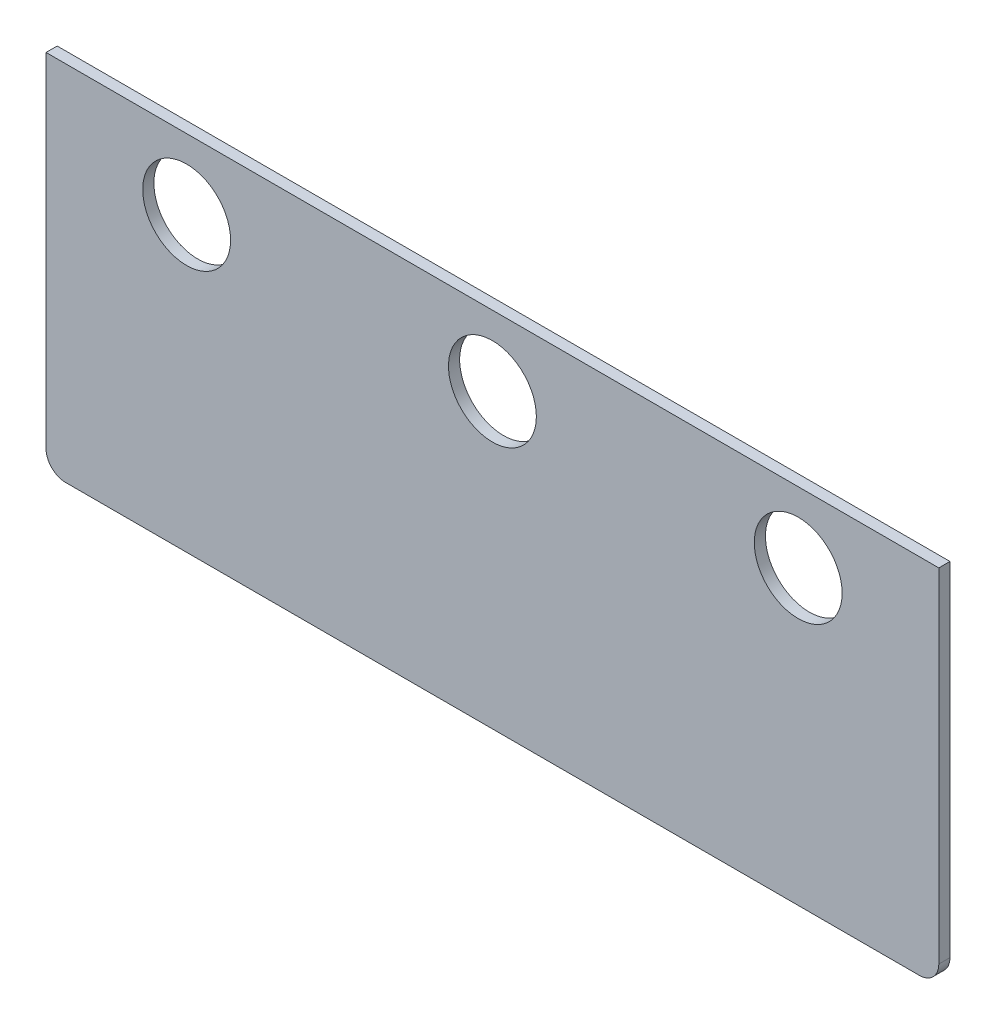
ISO-10303-21;
HEADER;
FILE_DESCRIPTION(('STEP AP214'),'2;1');
FILE_NAME('part.step','',(''),(''),'','','');
FILE_SCHEMA(('AUTOMOTIVE_DESIGN { 1 0 10303 214 1 1 1 1 }'));
ENDSEC;
DATA;
#1=APPLICATION_CONTEXT('core data for automotive mechanical design processes');
#2=APPLICATION_PROTOCOL_DEFINITION('international standard','automotive_design',2000,#1);
#3=PRODUCT_CONTEXT('',#1,'mechanical');
#4=PRODUCT('Part','Part','',(#3));
#5=PRODUCT_RELATED_PRODUCT_CATEGORY('part','',(#4));
#6=PRODUCT_DEFINITION_FORMATION('','',#4);
#7=PRODUCT_DEFINITION_CONTEXT('part definition',#1,'design');
#8=PRODUCT_DEFINITION('design','',#6,#7);
#9=PRODUCT_DEFINITION_SHAPE('','',#8);
#10=(LENGTH_UNIT() NAMED_UNIT(*) SI_UNIT(.MILLI.,.METRE.));
#11=(NAMED_UNIT(*) PLANE_ANGLE_UNIT() SI_UNIT($,.RADIAN.));
#12=(NAMED_UNIT(*) SI_UNIT($,.STERADIAN.) SOLID_ANGLE_UNIT());
#13=UNCERTAINTY_MEASURE_WITH_UNIT(LENGTH_MEASURE(1.E-05),#10,'distance_accuracy_value','');
#14=(GEOMETRIC_REPRESENTATION_CONTEXT(3) GLOBAL_UNCERTAINTY_ASSIGNED_CONTEXT((#13)) GLOBAL_UNIT_ASSIGNED_CONTEXT((#10,
#11,#12)) REPRESENTATION_CONTEXT('',''));
#15=CARTESIAN_POINT('',(0.,0.,0.));
#16=DIRECTION('',(0.,0.,1.));
#17=DIRECTION('',(1.,0.,0.));
#18=AXIS2_PLACEMENT_3D('',#15,#16,#17);
#19=CARTESIAN_POINT('',(0.,0.,3.17499999999998));
#20=DIRECTION('',(0.,0.,1.));
#21=DIRECTION('',(1.,0.,0.));
#22=AXIS2_PLACEMENT_3D('',#19,#20,#21);
#23=PLANE('',#22);
#24=CARTESIAN_POINT('',(-87.,83.1750000000001,3.17499999999998));
#25=DIRECTION('',(0.,0.,1.));
#26=DIRECTION('',(1.,0.,0.));
#27=AXIS2_PLACEMENT_3D('',#24,#25,#26);
#28=CIRCLE('',#27,12.5);
#29=CARTESIAN_POINT('',(-74.5,83.1750000000001,3.17499999999998));
#30=VERTEX_POINT('',#29);
#31=EDGE_CURVE('E151',#30,#30,#28,.T.);
#32=ORIENTED_EDGE('',*,*,#31,.F.);
#33=EDGE_LOOP('',(#32));
#34=FACE_BOUND('',#33,.T.);
#35=DIRECTION('',(1.,0.,0.));
#36=VECTOR('',#35,1.);
#37=CARTESIAN_POINT('',(-127.,0.,3.17499999999998));
#38=LINE('',#37,#36);
#39=CARTESIAN_POINT('',(-121.44375,0.,3.17499999999998));
#40=VERTEX_POINT('',#39);
#41=CARTESIAN_POINT('',(121.44375,0.,3.17499999999998));
#42=VERTEX_POINT('',#41);
#43=EDGE_CURVE('E94',#40,#42,#38,.T.);
#44=ORIENTED_EDGE('',*,*,#43,.T.);
#45=CARTESIAN_POINT('',(121.44375,5.55625000000004,3.17499999999998));
#46=DIRECTION('',(0.,0.,1.));
#47=DIRECTION('',(1.,0.,0.));
#48=AXIS2_PLACEMENT_3D('',#45,#46,#47);
#49=CIRCLE('',#48,5.55625);
#50=CARTESIAN_POINT('',(127.,5.55625000000004,3.17499999999998));
#51=VERTEX_POINT('',#50);
#52=EDGE_CURVE('E42',#42,#51,#49,.T.);
#53=ORIENTED_EDGE('',*,*,#52,.T.);
#54=DIRECTION('',(0.,1.,0.));
#55=VECTOR('',#54,1.);
#56=CARTESIAN_POINT('',(127.,0.,3.17499999999998));
#57=LINE('',#56,#55);
#58=CARTESIAN_POINT('',(127.,103.175,3.17499999999998));
#59=VERTEX_POINT('',#58);
#60=EDGE_CURVE('E100',#51,#59,#57,.T.);
#61=ORIENTED_EDGE('',*,*,#60,.T.);
#62=DIRECTION('',(-1.,0.,0.));
#63=VECTOR('',#62,1.);
#64=CARTESIAN_POINT('',(127.,103.175,3.17499999999998));
#65=LINE('',#64,#63);
#66=CARTESIAN_POINT('',(-127.,103.175,3.17499999999998));
#67=VERTEX_POINT('',#66);
#68=EDGE_CURVE('E95',#59,#67,#65,.T.);
#69=ORIENTED_EDGE('',*,*,#68,.T.);
#70=DIRECTION('',(0.,-1.,0.));
#71=VECTOR('',#70,1.);
#72=CARTESIAN_POINT('',(-127.,103.175,3.17499999999998));
#73=LINE('',#72,#71);
#74=CARTESIAN_POINT('',(-127.,5.55625000000004,3.17499999999998));
#75=VERTEX_POINT('',#74);
#76=EDGE_CURVE('E86',#67,#75,#73,.T.);
#77=ORIENTED_EDGE('',*,*,#76,.T.);
#78=CARTESIAN_POINT('',(-121.44375,5.55625000000004,3.17499999999998));
#79=DIRECTION('',(0.,0.,1.));
#80=DIRECTION('',(1.,0.,0.));
#81=AXIS2_PLACEMENT_3D('',#78,#79,#80);
#82=CIRCLE('',#81,5.55625);
#83=EDGE_CURVE('E125',#75,#40,#82,.T.);
#84=ORIENTED_EDGE('',*,*,#83,.T.);
#85=EDGE_LOOP('',(#44,#53,#61,#69,#77,#84));
#86=FACE_BOUND('',#85,.T.);
#87=CARTESIAN_POINT('',(87.,83.1750000000001,3.17499999999998));
#88=DIRECTION('',(0.,0.,1.));
#89=DIRECTION('',(1.,0.,0.));
#90=AXIS2_PLACEMENT_3D('',#87,#88,#89);
#91=CIRCLE('',#90,12.5);
#92=CARTESIAN_POINT('',(99.5,83.1750000000001,3.17499999999998));
#93=VERTEX_POINT('',#92);
#94=EDGE_CURVE('E145',#93,#93,#91,.T.);
#95=ORIENTED_EDGE('',*,*,#94,.F.);
#96=EDGE_LOOP('',(#95));
#97=FACE_BOUND('',#96,.T.);
#98=CARTESIAN_POINT('',(0.,83.1750000000001,3.17499999999998));
#99=DIRECTION('',(0.,0.,1.));
#100=DIRECTION('',(1.,0.,0.));
#101=AXIS2_PLACEMENT_3D('',#98,#99,#100);
#102=CIRCLE('',#101,12.5);
#103=CARTESIAN_POINT('',(12.5,83.1750000000001,3.17499999999998));
#104=VERTEX_POINT('',#103);
#105=EDGE_CURVE('E157',#104,#104,#102,.T.);
#106=ORIENTED_EDGE('',*,*,#105,.F.);
#107=EDGE_LOOP('',(#106));
#108=FACE_BOUND('',#107,.T.);
#109=ADVANCED_FACE('F34',(#34,#86,#97,#108),#23,.T.);
#110=CARTESIAN_POINT('',(0.,0.,0.));
#111=DIRECTION('',(0.,0.,1.));
#112=DIRECTION('',(1.,0.,0.));
#113=AXIS2_PLACEMENT_3D('',#110,#111,#112);
#114=PLANE('',#113);
#115=DIRECTION('',(0.,1.,0.));
#116=VECTOR('',#115,1.);
#117=CARTESIAN_POINT('',(127.,0.,0.));
#118=LINE('',#117,#116);
#119=CARTESIAN_POINT('',(127.,5.55625000000004,0.));
#120=VERTEX_POINT('',#119);
#121=CARTESIAN_POINT('',(127.,103.175,0.));
#122=VERTEX_POINT('',#121);
#123=EDGE_CURVE('E104',#120,#122,#118,.T.);
#124=ORIENTED_EDGE('',*,*,#123,.F.);
#125=CARTESIAN_POINT('',(121.44375,5.55625000000004,0.));
#126=DIRECTION('',(0.,0.,1.));
#127=DIRECTION('',(1.,0.,0.));
#128=AXIS2_PLACEMENT_3D('',#125,#126,#127);
#129=CIRCLE('',#128,5.55625);
#130=CARTESIAN_POINT('',(121.44375,0.,0.));
#131=VERTEX_POINT('',#130);
#132=EDGE_CURVE('E119',#120,#131,#129,.F.);
#133=ORIENTED_EDGE('',*,*,#132,.T.);
#134=DIRECTION('',(1.,0.,0.));
#135=VECTOR('',#134,1.);
#136=CARTESIAN_POINT('',(-127.,0.,0.));
#137=LINE('',#136,#135);
#138=CARTESIAN_POINT('',(-121.44375,0.,0.));
#139=VERTEX_POINT('',#138);
#140=EDGE_CURVE('E138',#139,#131,#137,.T.);
#141=ORIENTED_EDGE('',*,*,#140,.F.);
#142=CARTESIAN_POINT('',(-121.44375,5.55625000000004,0.));
#143=DIRECTION('',(0.,0.,1.));
#144=DIRECTION('',(1.,0.,0.));
#145=AXIS2_PLACEMENT_3D('',#142,#143,#144);
#146=CIRCLE('',#145,5.55625);
#147=CARTESIAN_POINT('',(-127.,5.55625000000004,0.));
#148=VERTEX_POINT('',#147);
#149=EDGE_CURVE('E113',#139,#148,#146,.F.);
#150=ORIENTED_EDGE('',*,*,#149,.T.);
#151=DIRECTION('',(0.,-1.,0.));
#152=VECTOR('',#151,1.);
#153=CARTESIAN_POINT('',(-127.,103.175,0.));
#154=LINE('',#153,#152);
#155=CARTESIAN_POINT('',(-127.,103.175,0.));
#156=VERTEX_POINT('',#155);
#157=EDGE_CURVE('E141',#156,#148,#154,.T.);
#158=ORIENTED_EDGE('',*,*,#157,.F.);
#159=DIRECTION('',(-1.,0.,0.));
#160=VECTOR('',#159,1.);
#161=CARTESIAN_POINT('',(127.,103.175,0.));
#162=LINE('',#161,#160);
#163=EDGE_CURVE('E108',#122,#156,#162,.T.);
#164=ORIENTED_EDGE('',*,*,#163,.F.);
#165=EDGE_LOOP('',(#124,#133,#141,#150,#158,#164));
#166=FACE_BOUND('',#165,.T.);
#167=CARTESIAN_POINT('',(87.,83.1750000000001,0.));
#168=DIRECTION('',(0.,0.,1.));
#169=DIRECTION('',(1.,0.,0.));
#170=AXIS2_PLACEMENT_3D('',#167,#168,#169);
#171=CIRCLE('',#170,12.5);
#172=CARTESIAN_POINT('',(99.5,83.1750000000001,0.));
#173=VERTEX_POINT('',#172);
#174=EDGE_CURVE('E148',#173,#173,#171,.T.);
#175=ORIENTED_EDGE('',*,*,#174,.T.);
#176=EDGE_LOOP('',(#175));
#177=FACE_BOUND('',#176,.T.);
#178=CARTESIAN_POINT('',(-87.,83.1750000000001,0.));
#179=DIRECTION('',(0.,0.,1.));
#180=DIRECTION('',(1.,0.,0.));
#181=AXIS2_PLACEMENT_3D('',#178,#179,#180);
#182=CIRCLE('',#181,12.5);
#183=CARTESIAN_POINT('',(-74.5,83.1750000000001,0.));
#184=VERTEX_POINT('',#183);
#185=EDGE_CURVE('E154',#184,#184,#182,.T.);
#186=ORIENTED_EDGE('',*,*,#185,.T.);
#187=EDGE_LOOP('',(#186));
#188=FACE_BOUND('',#187,.T.);
#189=CARTESIAN_POINT('',(0.,83.1750000000001,0.));
#190=DIRECTION('',(0.,0.,1.));
#191=DIRECTION('',(1.,0.,0.));
#192=AXIS2_PLACEMENT_3D('',#189,#190,#191);
#193=CIRCLE('',#192,12.5);
#194=CARTESIAN_POINT('',(12.5,83.1750000000001,0.));
#195=VERTEX_POINT('',#194);
#196=EDGE_CURVE('E160',#195,#195,#193,.T.);
#197=ORIENTED_EDGE('',*,*,#196,.T.);
#198=EDGE_LOOP('',(#197));
#199=FACE_BOUND('',#198,.T.);
#200=ADVANCED_FACE('F136',(#166,#177,#188,#199),#114,.F.);
#201=CARTESIAN_POINT('',(127.,103.175,3.17499999999998));
#202=DIRECTION('',(0.,-1.,0.));
#203=DIRECTION('',(0.,0.,-1.));
#204=AXIS2_PLACEMENT_3D('',#201,#202,#203);
#205=PLANE('',#204);
#206=ORIENTED_EDGE('',*,*,#163,.T.);
#207=DIRECTION('',(0.,0.,-1.));
#208=VECTOR('',#207,1.);
#209=CARTESIAN_POINT('',(-127.,103.175,3.17499999999998));
#210=LINE('',#209,#208);
#211=EDGE_CURVE('E90',#67,#156,#210,.T.);
#212=ORIENTED_EDGE('',*,*,#211,.F.);
#213=ORIENTED_EDGE('',*,*,#68,.F.);
#214=DIRECTION('',(0.,0.,-1.));
#215=VECTOR('',#214,1.);
#216=CARTESIAN_POINT('',(127.,103.175,3.17499999999998));
#217=LINE('',#216,#215);
#218=EDGE_CURVE('E110',#59,#122,#217,.T.);
#219=ORIENTED_EDGE('',*,*,#218,.T.);
#220=EDGE_LOOP('',(#206,#212,#213,#219));
#221=FACE_BOUND('',#220,.T.);
#222=ADVANCED_FACE('F106',(#221),#205,.F.);
#223=CARTESIAN_POINT('',(-127.,103.175,3.17499999999998));
#224=DIRECTION('',(1.,0.,0.));
#225=DIRECTION('',(0.,0.,-1.));
#226=AXIS2_PLACEMENT_3D('',#223,#224,#225);
#227=PLANE('',#226);
#228=ORIENTED_EDGE('',*,*,#157,.T.);
#229=DIRECTION('',(0.,0.,-1.));
#230=VECTOR('',#229,1.);
#231=CARTESIAN_POINT('',(-127.,5.55625000000004,3.17499999999998));
#232=LINE('',#231,#230);
#233=EDGE_CURVE('E11',#148,#75,#232,.F.);
#234=ORIENTED_EDGE('',*,*,#233,.T.);
#235=ORIENTED_EDGE('',*,*,#76,.F.);
#236=ORIENTED_EDGE('',*,*,#211,.T.);
#237=EDGE_LOOP('',(#228,#234,#235,#236));
#238=FACE_BOUND('',#237,.T.);
#239=ADVANCED_FACE('F88',(#238),#227,.F.);
#240=CARTESIAN_POINT('',(-127.,0.,3.17499999999998));
#241=DIRECTION('',(0.,1.,0.));
#242=DIRECTION('',(-1.,0.,0.));
#243=AXIS2_PLACEMENT_3D('',#240,#241,#242);
#244=PLANE('',#243);
#245=ORIENTED_EDGE('',*,*,#140,.T.);
#246=DIRECTION('',(0.,0.,-1.));
#247=VECTOR('',#246,1.);
#248=CARTESIAN_POINT('',(121.44375,0.,3.17499999999998));
#249=LINE('',#248,#247);
#250=EDGE_CURVE('E55',#131,#42,#249,.F.);
#251=ORIENTED_EDGE('',*,*,#250,.T.);
#252=ORIENTED_EDGE('',*,*,#43,.F.);
#253=DIRECTION('',(0.,0.,-1.));
#254=VECTOR('',#253,1.);
#255=CARTESIAN_POINT('',(-121.44375,0.,3.17499999999998));
#256=LINE('',#255,#254);
#257=EDGE_CURVE('E121',#40,#139,#256,.T.);
#258=ORIENTED_EDGE('',*,*,#257,.T.);
#259=EDGE_LOOP('',(#245,#251,#252,#258));
#260=FACE_BOUND('',#259,.T.);
#261=ADVANCED_FACE('F139',(#260),#244,.F.);
#262=CARTESIAN_POINT('',(127.,0.,3.17499999999998));
#263=DIRECTION('',(-1.,0.,0.));
#264=DIRECTION('',(0.,-1.,0.));
#265=AXIS2_PLACEMENT_3D('',#262,#263,#264);
#266=PLANE('',#265);
#267=ORIENTED_EDGE('',*,*,#60,.F.);
#268=DIRECTION('',(0.,0.,-1.));
#269=VECTOR('',#268,1.);
#270=CARTESIAN_POINT('',(127.,5.55625000000004,3.17499999999998));
#271=LINE('',#270,#269);
#272=EDGE_CURVE('E109',#51,#120,#271,.T.);
#273=ORIENTED_EDGE('',*,*,#272,.T.);
#274=ORIENTED_EDGE('',*,*,#123,.T.);
#275=ORIENTED_EDGE('',*,*,#218,.F.);
#276=EDGE_LOOP('',(#267,#273,#274,#275));
#277=FACE_BOUND('',#276,.T.);
#278=ADVANCED_FACE('F130',(#277),#266,.F.);
#279=CARTESIAN_POINT('',(87.,83.1750000000001,3.17499999999998));
#280=DIRECTION('',(0.,0.,-1.));
#281=DIRECTION('',(-1.,0.,0.));
#282=AXIS2_PLACEMENT_3D('',#279,#280,#281);
#283=CYLINDRICAL_SURFACE('',#282,12.5);
#284=ORIENTED_EDGE('',*,*,#94,.T.);
#285=EDGE_LOOP('',(#284));
#286=FACE_BOUND('',#285,.T.);
#287=ORIENTED_EDGE('',*,*,#174,.F.);
#288=EDGE_LOOP('',(#287));
#289=FACE_BOUND('',#288,.T.);
#290=ADVANCED_FACE('F178',(#286,#289),#283,.F.);
#291=CARTESIAN_POINT('',(-87.,83.1750000000001,3.17499999999998));
#292=DIRECTION('',(0.,0.,-1.));
#293=DIRECTION('',(-1.,0.,0.));
#294=AXIS2_PLACEMENT_3D('',#291,#292,#293);
#295=CYLINDRICAL_SURFACE('',#294,12.5);
#296=ORIENTED_EDGE('',*,*,#31,.T.);
#297=EDGE_LOOP('',(#296));
#298=FACE_BOUND('',#297,.T.);
#299=ORIENTED_EDGE('',*,*,#185,.F.);
#300=EDGE_LOOP('',(#299));
#301=FACE_BOUND('',#300,.T.);
#302=ADVANCED_FACE('F194',(#298,#301),#295,.F.);
#303=CARTESIAN_POINT('',(0.,83.1750000000001,3.17499999999998));
#304=DIRECTION('',(0.,0.,-1.));
#305=DIRECTION('',(-1.,0.,0.));
#306=AXIS2_PLACEMENT_3D('',#303,#304,#305);
#307=CYLINDRICAL_SURFACE('',#306,12.5);
#308=ORIENTED_EDGE('',*,*,#105,.T.);
#309=EDGE_LOOP('',(#308));
#310=FACE_BOUND('',#309,.T.);
#311=ORIENTED_EDGE('',*,*,#196,.F.);
#312=EDGE_LOOP('',(#311));
#313=FACE_BOUND('',#312,.T.);
#314=ADVANCED_FACE('F166',(#310,#313),#307,.F.);
#315=CARTESIAN_POINT('',(121.44375,5.55625000000004,3.17499999999998));
#316=DIRECTION('',(0.,0.,-1.));
#317=DIRECTION('',(-1.,0.,0.));
#318=AXIS2_PLACEMENT_3D('',#315,#316,#317);
#319=CYLINDRICAL_SURFACE('',#318,5.55625);
#320=ORIENTED_EDGE('',*,*,#52,.F.);
#321=ORIENTED_EDGE('',*,*,#250,.F.);
#322=ORIENTED_EDGE('',*,*,#132,.F.);
#323=ORIENTED_EDGE('',*,*,#272,.F.);
#324=EDGE_LOOP('',(#320,#321,#322,#323));
#325=FACE_BOUND('',#324,.T.);
#326=ADVANCED_FACE('F133',(#325),#319,.T.);
#327=CARTESIAN_POINT('',(-121.44375,5.55625000000004,3.17499999999998));
#328=DIRECTION('',(0.,0.,-1.));
#329=DIRECTION('',(-1.,0.,0.));
#330=AXIS2_PLACEMENT_3D('',#327,#328,#329);
#331=CYLINDRICAL_SURFACE('',#330,5.55625);
#332=ORIENTED_EDGE('',*,*,#83,.F.);
#333=ORIENTED_EDGE('',*,*,#233,.F.);
#334=ORIENTED_EDGE('',*,*,#149,.F.);
#335=ORIENTED_EDGE('',*,*,#257,.F.);
#336=EDGE_LOOP('',(#332,#333,#334,#335));
#337=FACE_BOUND('',#336,.T.);
#338=ADVANCED_FACE('F36',(#337),#331,.T.);
#339=CLOSED_SHELL('',(#109,#200,#222,#239,#261,#278,#290,#302,#314,#326,#338));
#340=MANIFOLD_SOLID_BREP('B2',#339);
#341=ADVANCED_BREP_SHAPE_REPRESENTATION('',(#18,#340),#14);
#342=SHAPE_DEFINITION_REPRESENTATION(#9,#341);
ENDSEC;
END-ISO-10303-21;
